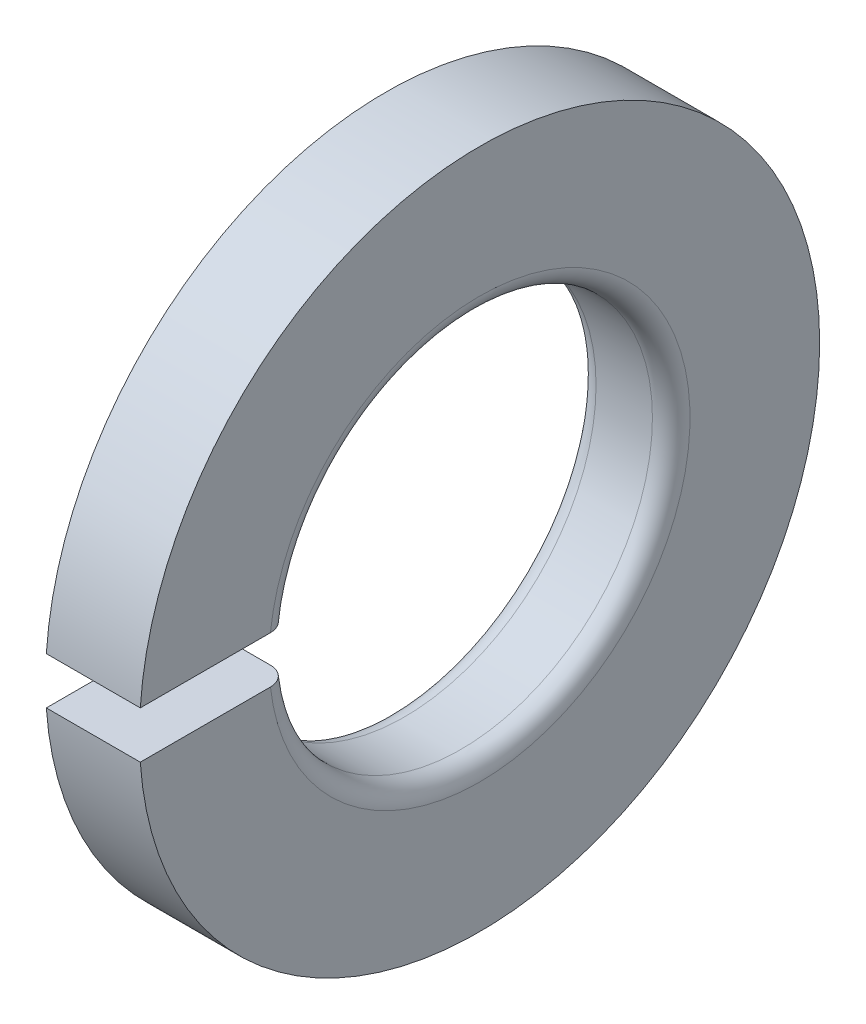
ISO-10303-21;
HEADER;
FILE_DESCRIPTION(('STEP AP214'),'2;1');
FILE_NAME('part.step','',(''),(''),'','','');
FILE_SCHEMA(('AUTOMOTIVE_DESIGN { 1 0 10303 214 1 1 1 1 }'));
ENDSEC;
DATA;
#1=APPLICATION_CONTEXT('core data for automotive mechanical design processes');
#2=APPLICATION_PROTOCOL_DEFINITION('international standard','automotive_design',2000,#1);
#3=PRODUCT_CONTEXT('',#1,'mechanical');
#4=PRODUCT('Part','Part','',(#3));
#5=PRODUCT_RELATED_PRODUCT_CATEGORY('part','',(#4));
#6=PRODUCT_DEFINITION_FORMATION('','',#4);
#7=PRODUCT_DEFINITION_CONTEXT('part definition',#1,'design');
#8=PRODUCT_DEFINITION('design','',#6,#7);
#9=PRODUCT_DEFINITION_SHAPE('','',#8);
#10=(LENGTH_UNIT() NAMED_UNIT(*) SI_UNIT(.MILLI.,.METRE.));
#11=(NAMED_UNIT(*) PLANE_ANGLE_UNIT() SI_UNIT($,.RADIAN.));
#12=(NAMED_UNIT(*) SI_UNIT($,.STERADIAN.) SOLID_ANGLE_UNIT());
#13=UNCERTAINTY_MEASURE_WITH_UNIT(LENGTH_MEASURE(1.E-05),#10,'distance_accuracy_value','');
#14=(GEOMETRIC_REPRESENTATION_CONTEXT(3) GLOBAL_UNCERTAINTY_ASSIGNED_CONTEXT((#13)) GLOBAL_UNIT_ASSIGNED_CONTEXT((#10,
#11,#12)) REPRESENTATION_CONTEXT('',''));
#15=CARTESIAN_POINT('',(0.,0.,0.));
#16=DIRECTION('',(0.,0.,1.));
#17=DIRECTION('',(1.,0.,0.));
#18=AXIS2_PLACEMENT_3D('',#15,#16,#17);
#19=CARTESIAN_POINT('',(-34.925,0.,0.));
#20=DIRECTION('',(-1.,0.,0.));
#21=DIRECTION('',(0.,0.,1.));
#22=AXIS2_PLACEMENT_3D('',#19,#20,#21);
#23=CYLINDRICAL_SURFACE('',#22,9.05);
#24=DIRECTION('',(-1.,0.,0.));
#25=VECTOR('',#24,1.);
#26=CARTESIAN_POINT('',(-34.925,0.624999999999987,9.02839271409928));
#27=LINE('',#26,#25);
#28=CARTESIAN_POINT('',(0.,0.624999999999987,9.02839271409928));
#29=VERTEX_POINT('',#28);
#30=CARTESIAN_POINT('',(-2.5,0.624999999999987,9.02839271409928));
#31=VERTEX_POINT('',#30);
#32=EDGE_CURVE('E251',#29,#31,#27,.T.);
#33=ORIENTED_EDGE('',*,*,#32,.F.);
#34=CARTESIAN_POINT('',(0.,0.,0.));
#35=DIRECTION('',(-1.,0.,0.));
#36=DIRECTION('',(0.,0.,1.));
#37=AXIS2_PLACEMENT_3D('',#34,#35,#36);
#38=CIRCLE('',#37,9.05);
#39=CARTESIAN_POINT('',(0.,-0.624999999999987,9.02839271409928));
#40=VERTEX_POINT('',#39);
#41=EDGE_CURVE('E11',#29,#40,#38,.T.);
#42=ORIENTED_EDGE('',*,*,#41,.T.);
#43=DIRECTION('',(1.,0.,0.));
#44=VECTOR('',#43,1.);
#45=CARTESIAN_POINT('',(-34.925,-0.624999999999987,9.02839271409928));
#46=LINE('',#45,#44);
#47=CARTESIAN_POINT('',(-2.5,-0.624999999999987,9.02839271409928));
#48=VERTEX_POINT('',#47);
#49=EDGE_CURVE('E152',#48,#40,#46,.T.);
#50=ORIENTED_EDGE('',*,*,#49,.F.);
#51=CARTESIAN_POINT('',(-2.5,0.,0.));
#52=DIRECTION('',(-1.,0.,0.));
#53=DIRECTION('',(0.,0.,1.));
#54=AXIS2_PLACEMENT_3D('',#51,#52,#53);
#55=CIRCLE('',#54,9.05);
#56=EDGE_CURVE('E223',#31,#48,#55,.T.);
#57=ORIENTED_EDGE('',*,*,#56,.F.);
#58=EDGE_LOOP('',(#33,#42,#50,#57));
#59=FACE_BOUND('',#58,.T.);
#60=ADVANCED_FACE('F17',(#59),#23,.T.);
#61=CARTESIAN_POINT('',(0.,5.6,0.));
#62=DIRECTION('',(-1.,0.,0.));
#63=DIRECTION('',(0.,0.,1.));
#64=AXIS2_PLACEMENT_3D('',#61,#62,#63);
#65=PLANE('',#64);
#66=DIRECTION('',(0.,0.,-1.));
#67=VECTOR('',#66,1.);
#68=CARTESIAN_POINT('',(0.,0.624999999999987,9.231));
#69=LINE('',#68,#67);
#70=CARTESIAN_POINT('',(0.,0.624999999999987,5.56501347707261));
#71=VERTEX_POINT('',#70);
#72=EDGE_CURVE('E144',#29,#71,#69,.T.);
#73=ORIENTED_EDGE('',*,*,#72,.T.);
#74=CARTESIAN_POINT('',(0.,0.,0.));
#75=DIRECTION('',(-1.,0.,0.));
#76=DIRECTION('',(0.,0.,1.));
#77=AXIS2_PLACEMENT_3D('',#74,#75,#76);
#78=CIRCLE('',#77,5.6);
#79=CARTESIAN_POINT('',(0.,-0.624999999999987,5.56501347707261));
#80=VERTEX_POINT('',#79);
#81=EDGE_CURVE('E30',#71,#80,#78,.T.);
#82=ORIENTED_EDGE('',*,*,#81,.T.);
#83=DIRECTION('',(0.,0.,1.));
#84=VECTOR('',#83,1.);
#85=CARTESIAN_POINT('',(0.,-0.624999999999987,0.));
#86=LINE('',#85,#84);
#87=EDGE_CURVE('E164',#80,#40,#86,.T.);
#88=ORIENTED_EDGE('',*,*,#87,.T.);
#89=ORIENTED_EDGE('',*,*,#41,.F.);
#90=EDGE_LOOP('',(#73,#82,#88,#89));
#91=FACE_BOUND('',#90,.T.);
#92=ADVANCED_FACE('F19',(#91),#65,.F.);
#93=CARTESIAN_POINT('',(-0.5,0.,0.));
#94=DIRECTION('',(-1.,0.,0.));
#95=DIRECTION('',(0.,0.,1.));
#96=AXIS2_PLACEMENT_3D('',#93,#94,#95);
#97=TOROIDAL_SURFACE('',#96,5.6,0.5);
#98=ORIENTED_EDGE('',*,*,#81,.F.);
#99=CARTESIAN_POINT('',(0.,0.624999999999987,5.56501347707261));
#100=CARTESIAN_POINT('',(6.59780501506631E-08,0.625000000845204,5.55851040345573));
#101=CARTESIAN_POINT('',(-0.000125287864080179,0.624996955745399,5.55200734299681));
#102=CARTESIAN_POINT('',(-0.000620427819549987,0.624985934572421,5.53916576996588));
#103=CARTESIAN_POINT('',(-0.000984317260953367,0.62497807774707,5.53282702949047));
#104=CARTESIAN_POINT('',(-0.001938510558033,0.624958733961064,5.5203222625209));
#105=CARTESIAN_POINT('',(-0.00252307053008751,0.624947340298171,5.51415579716452));
#106=CARTESIAN_POINT('',(-0.00390067827574387,0.624922080522118,5.50200245628998));
#107=CARTESIAN_POINT('',(-0.00468814408183376,0.624908283397852,5.49601494746372));
#108=CARTESIAN_POINT('',(-0.00645392462280786,0.624879235039241,5.48422518281379));
#109=CARTESIAN_POINT('',(-0.00742682432502172,0.624864030195836,5.47842211544602));
#110=CARTESIAN_POINT('',(-0.00954615200121427,0.624833051636332,5.46700576060904));
#111=CARTESIAN_POINT('',(-0.0106873366204526,0.62481730343893,5.46139149925642));
#112=CARTESIAN_POINT('',(-0.0131262988976051,0.624785996474455,5.45035621561468));
#113=CARTESIAN_POINT('',(-0.0144190083166586,0.624770444098366,5.44493407285757));
#114=CARTESIAN_POINT('',(-0.0171445043310246,0.62474016662692,5.43428552106857));
#115=CARTESIAN_POINT('',(-0.0185724006804081,0.624725430552137,5.42905785961363));
#116=CARTESIAN_POINT('',(-0.0215522582860248,0.624697310245538,5.41879977798227));
#117=CARTESIAN_POINT('',(-0.0230995080894126,0.624683899416331,5.41376799036812));
#118=CARTESIAN_POINT('',(-0.0263024451270901,0.624658846516341,5.40390260180359));
#119=CARTESIAN_POINT('',(-0.0279536040925807,0.62464716402195,5.39906752482713));
#120=CARTESIAN_POINT('',(-0.0329690258568944,0.62461574439813,5.38507792322897));
#121=CARTESIAN_POINT('',(-0.0365263121360745,0.62459833726402,5.37599169022062));
#122=CARTESIAN_POINT('',(-0.0439178576529249,0.624573658978008,5.35861058067613));
#123=CARTESIAN_POINT('',(-0.0477202103338952,0.624565814654118,5.3503020784901));
#124=CARTESIAN_POINT('',(-0.0554967328799935,0.624560526658418,5.33445879686766));
#125=CARTESIAN_POINT('',(-0.0594418047136641,0.624562414288829,5.32690973650451));
#126=CARTESIAN_POINT('',(-0.0674078213374483,0.624575803028408,5.31256170915133));
#127=CARTESIAN_POINT('',(-0.0714024179406484,0.624586595544608,5.30574809938418));
#128=CARTESIAN_POINT('',(-0.0793811263442449,0.624616153798644,5.29284192938314));
#129=CARTESIAN_POINT('',(-0.0833415336179333,0.624634228514926,5.28673470419488));
#130=CARTESIAN_POINT('',(-0.0911747697193877,0.624676075978489,5.27520885507045));
#131=CARTESIAN_POINT('',(-0.09502642308413,0.62469923371813,5.26977582812587));
#132=CARTESIAN_POINT('',(-0.102573989369437,0.624748448204399,5.25956396668853));
#133=CARTESIAN_POINT('',(-0.106251129898657,0.624774035781096,5.25477124654252));
#134=CARTESIAN_POINT('',(-0.113389974101851,0.624825164037116,5.24580496250638));
#135=CARTESIAN_POINT('',(-0.116835178906566,0.624850441194317,5.24161825367033));
#136=CARTESIAN_POINT('',(-0.123458430138198,0.624897290942914,5.23382954571968));
#137=CARTESIAN_POINT('',(-0.126622118906708,0.624918957194616,5.23021532859649));
#138=CARTESIAN_POINT('',(-0.13263798815907,0.624956523541369,5.22353855665422));
#139=CARTESIAN_POINT('',(-0.135477829915462,0.62497280687798,5.22046488836805));
#140=CARTESIAN_POINT('',(-0.140808687029574,0.62499243369258,5.21483899777136));
#141=CARTESIAN_POINT('',(-0.143289239057397,0.624997333709423,5.21227683690016));
#142=CARTESIAN_POINT('',(-0.152047430137369,0.625006645299554,5.20342226533236));
#143=CARTESIAN_POINT('',(-0.158467233711204,0.62499941524355,5.19726918289311));
#144=CARTESIAN_POINT('',(-0.171556557007585,0.624987913391408,5.18537469512023));
#145=CARTESIAN_POINT('',(-0.178222829485211,0.624983611935698,5.17962970670287));
#146=CARTESIAN_POINT('',(-0.191778378900271,0.624971776744908,5.16855660811742));
#147=CARTESIAN_POINT('',(-0.198664628514998,0.624964276971784,5.16322479445432));
#148=CARTESIAN_POINT('',(-0.212632592576255,0.624949411602847,5.15298159099224));
#149=CARTESIAN_POINT('',(-0.219711513947492,0.624942045423773,5.14806639140252));
#150=CARTESIAN_POINT('',(-0.234038126394589,0.624927950039189,5.13865823685126));
#151=CARTESIAN_POINT('',(-0.241283255893629,0.624921214943851,5.13416138114226));
#152=CARTESIAN_POINT('',(-0.255916108646316,0.624909306136375,5.12559013527452));
#153=CARTESIAN_POINT('',(-0.263301502470205,0.624904116611786,5.12151176797196));
#154=CARTESIAN_POINT('',(-0.278189417773547,0.624895788311472,5.11377619729204));
#155=CARTESIAN_POINT('',(-0.285689840637396,0.624892628188322,5.11011495464055));
#156=CARTESIAN_POINT('',(-0.300783101479257,0.624888650247615,5.10321090163311));
#157=CARTESIAN_POINT('',(-0.308374069835075,0.624887807531356,5.09996400367337));
#158=CARTESIAN_POINT('',(-0.32362453452983,0.624888508058156,5.09388456881241));
#159=CARTESIAN_POINT('',(-0.331282387597626,0.624890025450748,5.09104790932106));
#160=CARTESIAN_POINT('',(-0.346643614080912,0.624895268600954,5.08578363245915));
#161=CARTESIAN_POINT('',(-0.354345567264022,0.624898969957325,5.08335187036523));
#162=CARTESIAN_POINT('',(-0.369772914641155,0.624908189613447,5.0788909139666));
#163=CARTESIAN_POINT('',(-0.377497107680679,0.62491368736733,5.07685756514465));
#164=CARTESIAN_POINT('',(-0.392947824139409,0.624925907254037,5.07318589578102));
#165=CARTESIAN_POINT('',(-0.400673360929644,0.624932615048808,5.07154342275553));
#166=CARTESIAN_POINT('',(-0.416106656870461,0.624946475085499,5.06864499623157));
#167=CARTESIAN_POINT('',(-0.42381363881275,0.624953621480556,5.06738490351081));
#168=CARTESIAN_POINT('',(-0.439190744480218,0.624967398337354,5.06524183013914));
#169=CARTESIAN_POINT('',(-0.446860294830996,0.624974033731456,5.06435473441626));
#170=CARTESIAN_POINT('',(-0.462144510212579,0.624985682482991,5.06294750626103));
#171=CARTESIAN_POINT('',(-0.469758799591386,0.624990713525667,5.06242329244566));
#172=CARTESIAN_POINT('',(-0.48491551078117,0.624997835062903,5.06173076866027));
#173=CARTESIAN_POINT('',(-0.492457748395457,0.62499995880892,5.06155842288894));
#174=CARTESIAN_POINT('',(-0.500000000000001,0.624999999999985,5.06155855443756));
#175=B_SPLINE_CURVE_WITH_KNOTS('',3,(#99,#100,#101,#102,#103,#104,#105,#106,#107,#108,#109,#110,
#111,#112,#113,#114,#115,#116,#117,#118,#119,#120,#121,#122,#123,#124,#125,#126,#127,#128,#129,
#130,#131,#132,#133,#134,#135,#136,#137,#138,#139,#140,#141,#142,#143,#144,#145,#146,#147,#148,
#149,#150,#151,#152,#153,#154,#155,#156,#157,#158,#159,#160,#161,#162,#163,#164,#165,#166,#167,
#168,#169,#170,#171,#172,#173,#174),.UNSPECIFIED.,.F.,.F.,(4,2,2,2,2,2,2,2,2,2,2,2,2,2,2,2,2,2,
2,2,2,2,2,2,2,2,2,2,2,2,2,2,2,2,2,2,2,4),(0.,0.0195079783160063,0.0385510295955347,
0.0571292177717187,0.0752426056286643,0.0928912545795553,0.110075224478616,0.126794573464747,
0.143049357834632,0.158839631943188,0.174165448129251,0.203420844840743,0.230819531412524,
0.256361782271762,0.280047844112425,0.301877937879394,0.321852261670791,0.339970994652557,
0.356234302309494,0.370642343797479,0.383195283094512,0.393893307845129,0.420556410403616,
0.44694529554863,0.473060681647196,0.498903279539482,0.524473794337526,0.549772927406307,
0.574801378511541,0.59955984811968,0.624049039836798,0.648269662974223,0.672222435229901,
0.695908085475639,0.719327356641463,0.742481008689363,0.765369821669714,0.78799459885461),.UNSPECIFIED.);
#176=CARTESIAN_POINT('',(-0.5,0.624999999999987,5.06155855443757));
#177=VERTEX_POINT('',#176);
#178=EDGE_CURVE('E109',#71,#177,#175,.T.);
#179=ORIENTED_EDGE('',*,*,#178,.T.);
#180=CARTESIAN_POINT('',(-0.5,0.,0.));
#181=DIRECTION('',(-1.,0.,0.));
#182=DIRECTION('',(0.,0.,1.));
#183=AXIS2_PLACEMENT_3D('',#180,#181,#182);
#184=CIRCLE('',#183,5.1);
#185=CARTESIAN_POINT('',(-0.5,-0.624999999999987,5.06155855443757));
#186=VERTEX_POINT('',#185);
#187=EDGE_CURVE('E101',#177,#186,#184,.T.);
#188=ORIENTED_EDGE('',*,*,#187,.T.);
#189=CARTESIAN_POINT('',(-0.500000000000001,-0.624999999999989,5.06155855443756));
#190=CARTESIAN_POINT('',(-0.492457191536266,-0.624999958554311,5.06155842285835));
#191=CARTESIAN_POINT('',(-0.484914397105156,-0.624997809473156,5.06173079720451));
#192=CARTESIAN_POINT('',(-0.469755961467032,-0.624990597894243,5.06242346195753));
#193=CARTESIAN_POINT('',(-0.462140505783656,-0.62498550145791,5.06294781689648));
#194=CARTESIAN_POINT('',(-0.446853358934062,-0.624973692947545,5.06435549543978));
#195=CARTESIAN_POINT('',(-0.439182046164309,-0.624966962743637,5.06524292972258));
#196=CARTESIAN_POINT('',(-0.423800836938118,-0.624952977294068,5.0673869333134));
#197=CARTESIAN_POINT('',(-0.416091518099495,-0.6249457168823,5.06864764746104));
#198=CARTESIAN_POINT('',(-0.400652998394545,-0.624931619804802,5.07154765489482));
#199=CARTESIAN_POINT('',(-0.392924580560545,-0.624924788942712,5.07319111756362));
#200=CARTESIAN_POINT('',(-0.377467589667372,-0.624912323594487,5.07686518844619));
#201=CARTESIAN_POINT('',(-0.36974001071944,-0.624906703569339,5.07889997960361));
#202=CARTESIAN_POINT('',(-0.354305425917712,-0.624897249351424,5.08336432550196));
#203=CARTESIAN_POINT('',(-0.346599630432713,-0.624893435969404,5.08579806541951));
#204=CARTESIAN_POINT('',(-0.331230309757538,-0.624887987546708,5.09106688291163));
#205=CARTESIAN_POINT('',(-0.323568215814988,-0.624886377289024,5.09390613595984));
#206=CARTESIAN_POINT('',(-0.308308925181056,-0.624885517961103,5.09999141972296));
#207=CARTESIAN_POINT('',(-0.300713384640359,-0.624886295214148,5.10324160375243));
#208=CARTESIAN_POINT('',(-0.28561071003129,-0.62489017655981,5.11015296319298));
#209=CARTESIAN_POINT('',(-0.278105460385771,-0.624893306089301,5.11381825678145));
#210=CARTESIAN_POINT('',(-0.263207706253143,-0.624901613918993,5.12156273084565));
#211=CARTESIAN_POINT('',(-0.255817317153189,-0.624906814141448,5.12564598088527));
#212=CARTESIAN_POINT('',(-0.241174381845176,-0.624918790809538,5.13422785463937));
#213=CARTESIAN_POINT('',(-0.233924183849885,-0.624925583659497,5.13873048536279));
#214=CARTESIAN_POINT('',(-0.219587444728851,-0.624939844023081,5.14815110591014));
#215=CARTESIAN_POINT('',(-0.212503486009694,-0.624947317979889,5.15307302577373));
#216=CARTESIAN_POINT('',(-0.198525567870418,-0.624962456071597,5.16333063083537));
#217=CARTESIAN_POINT('',(-0.191634424412976,-0.624970121383169,5.168670154388));
#218=CARTESIAN_POINT('',(-0.178069328489256,-0.624982328101126,5.17975966956031));
#219=CARTESIAN_POINT('',(-0.171398428344967,-0.624986835751931,5.1855133923483));
#220=CARTESIAN_POINT('',(-0.1583002105224,-0.624998860193376,5.19742637021581));
#221=CARTESIAN_POINT('',(-0.151876167038019,-0.625006407939398,5.20358923499404));
#222=CARTESIAN_POINT('',(-0.143122254825082,-0.624997438754946,5.2124482207635));
#223=CARTESIAN_POINT('',(-0.140649626593346,-0.624992647962884,5.21500457242046));
#224=CARTESIAN_POINT('',(-0.135334125446031,-0.624973225151546,5.22061915918454));
#225=CARTESIAN_POINT('',(-0.132501705625172,-0.624957025565068,5.22368731453754));
#226=CARTESIAN_POINT('',(-0.126500144944105,-0.624919618093228,5.23035333201988));
#227=CARTESIAN_POINT('',(-0.123343335028073,-0.624898023763593,5.23396229202162));
#228=CARTESIAN_POINT('',(-0.116733269880018,-0.624851298944708,5.241740727057));
#229=CARTESIAN_POINT('',(-0.113294367363827,-0.624826071884596,5.24592240767448));
#230=CARTESIAN_POINT('',(-0.106167525562274,-0.624775024529496,5.25487885865877));
#231=CARTESIAN_POINT('',(-0.102496083024068,-0.624749466335286,5.25966676458653));
#232=CARTESIAN_POINT('',(-0.0949592870122548,-0.624700289996601,5.26986921558969));
#233=CARTESIAN_POINT('',(-0.0911127067671575,-0.624677140204247,5.27529763992021));
#234=CARTESIAN_POINT('',(-0.0832889753111828,-0.624635289206896,5.28681450843343));
#235=CARTESIAN_POINT('',(-0.0793330034996413,-0.624617202742459,5.2929173520542));
#236=CARTESIAN_POINT('',(-0.0713625173529003,-0.624587603774591,5.30581500157371));
#237=CARTESIAN_POINT('',(-0.0673717147645487,-0.624576782396494,5.31262447147252));
#238=CARTESIAN_POINT('',(-0.0594126405468664,-0.624563322149475,5.3269644900487));
#239=CARTESIAN_POINT('',(-0.0554707278184174,-0.62456139225955,5.3345096828816));
#240=CARTESIAN_POINT('',(-0.0476998923188422,-0.62456658623312,5.35034553794667));
#241=CARTESIAN_POINT('',(-0.0439000820171907,-0.624574379374018,5.35865048445522));
#242=CARTESIAN_POINT('',(-0.0365130179518011,-0.624598950666195,5.37602483465189));
#243=CARTESIAN_POINT('',(-0.0329576891405966,-0.624616302683686,5.38510786889196));
#244=CARTESIAN_POINT('',(-0.027944845465393,-0.624647640659406,5.39909275899843));
#245=CARTESIAN_POINT('',(-0.0262944586360789,-0.624659295928503,5.40392638872523));
#246=CARTESIAN_POINT('',(-0.0230929351995156,-0.62468429523275,5.41378899016649));
#247=CARTESIAN_POINT('',(-0.0215463299563252,-0.624697679780662,5.41881943868033));
#248=CARTESIAN_POINT('',(-0.0185676386857404,-0.624725748995312,5.42907495607845));
#249=CARTESIAN_POINT('',(-0.0171402674841175,-0.624740460344238,5.4343013931866));
#250=CARTESIAN_POINT('',(-0.0144157080470193,-0.624770690412438,5.44494761647425));
#251=CARTESIAN_POINT('',(-0.0131234137126929,-0.624786220188702,5.45036865585641));
#252=CARTESIAN_POINT('',(-0.0106851779841802,-0.624817484529665,5.46140185899575));
#253=CARTESIAN_POINT('',(-0.00954430877052018,-0.624833212770859,5.46701514396992));
#254=CARTESIAN_POINT('',(-0.00742551946853745,-0.624864154456175,5.4784296779725));
#255=CARTESIAN_POINT('',(-0.00645284696591561,-0.624879342436033,5.48423190157815));
#256=CARTESIAN_POINT('',(-0.00468744064516736,-0.62490836048716,5.49602011580837));
#257=CARTESIAN_POINT('',(-0.00390012638157403,-0.62492214420584,5.50200691858955));
#258=CARTESIAN_POINT('',(-0.00252275486893576,-0.62494738087554,5.51415898902024));
#259=CARTESIAN_POINT('',(-0.001938284400069,-0.624958764856831,5.52032489048164));
#260=CARTESIAN_POINT('',(-0.000984217620331299,-0.624978093157279,5.53282867506313));
#261=CARTESIAN_POINT('',(-0.000620370295352662,-0.624985944175475,5.53916699741182));
#262=CARTESIAN_POINT('',(-0.000125277473106898,-0.62499695765822,5.55200788240724));
#263=CARTESIAN_POINT('',(6.59659004187509E-08,-0.625000000846242,5.5585106731564));
#264=CARTESIAN_POINT('',(0.,-0.624999999999994,5.56501347707261));
#265=B_SPLINE_CURVE_WITH_KNOTS('',3,(#189,#190,#191,#192,#193,#194,#195,#196,#197,#198,#199,
#200,#201,#202,#203,#204,#205,#206,#207,#208,#209,#210,#211,#212,#213,#214,#215,#216,#217,#218,
#219,#220,#221,#222,#223,#224,#225,#226,#227,#228,#229,#230,#231,#232,#233,#234,#235,#236,#237,
#238,#239,#240,#241,#242,#243,#244,#245,#246,#247,#248,#249,#250,#251,#252,#253,#254,#255,#256,
#257,#258,#259,#260,#261,#262,#263,#264),.UNSPECIFIED.,.F.,.F.,(4,2,2,2,2,2,2,2,2,2,2,2,2,2,2,2,
2,2,2,2,2,2,2,2,2,2,2,2,2,2,2,2,2,2,2,2,2,4),(0.,0.0226264472708259,0.0455187761431365,
0.0686777914212465,0.0921042744625579,0.115798986334015,0.139762670890282,0.163996057767968,
0.188499865289246,0.213274803267192,0.238321575704117,0.263640883373033,0.289233426271268,
0.315099905934042,0.341241027594649,0.367657502176695,0.394350048102668,0.405019023931932,
0.417544714406765,0.431927307083685,0.44816696573594,0.466263849280953,0.486218122961331,
0.508029965708673,0.531699575399873,0.557227172775001,0.584613004342633,0.613857344367144,
0.629178304853884,0.644964172854977,0.661215000713339,0.677930842790853,0.695111755394114,
0.712757796674948,0.730869026503547,0.749445506312115,0.768487298906793,0.787994468245702),.UNSPECIFIED.);
#266=EDGE_CURVE('E190',#186,#80,#265,.T.);
#267=ORIENTED_EDGE('',*,*,#266,.T.);
#268=EDGE_LOOP('',(#98,#179,#188,#267));
#269=FACE_BOUND('',#268,.T.);
#270=ADVANCED_FACE('F134',(#269),#97,.T.);
#271=CARTESIAN_POINT('',(-34.925,0.,0.));
#272=DIRECTION('',(-1.,0.,0.));
#273=DIRECTION('',(0.,0.,1.));
#274=AXIS2_PLACEMENT_3D('',#271,#272,#273);
#275=CYLINDRICAL_SURFACE('',#274,5.1);
#276=DIRECTION('',(1.,0.,0.));
#277=VECTOR('',#276,1.);
#278=CARTESIAN_POINT('',(-34.925,0.624999999999987,5.06155855443757));
#279=LINE('',#278,#277);
#280=CARTESIAN_POINT('',(-2.00000000000069,0.624999999999987,5.06155855443091));
#281=VERTEX_POINT('',#280);
#282=EDGE_CURVE('E102',#281,#177,#279,.T.);
#283=ORIENTED_EDGE('',*,*,#282,.F.);
#284=CARTESIAN_POINT('',(-2.,0.,0.));
#285=DIRECTION('',(-1.,0.,0.));
#286=DIRECTION('',(0.,0.,1.));
#287=AXIS2_PLACEMENT_3D('',#284,#285,#286);
#288=CIRCLE('',#287,5.1);
#289=CARTESIAN_POINT('',(-2.,-0.624999999999987,5.06155855443757));
#290=VERTEX_POINT('',#289);
#291=EDGE_CURVE('E55',#281,#290,#288,.T.);
#292=ORIENTED_EDGE('',*,*,#291,.T.);
#293=DIRECTION('',(-1.,0.,0.));
#294=VECTOR('',#293,1.);
#295=CARTESIAN_POINT('',(-34.925,-0.624999999999987,5.06155855443757));
#296=LINE('',#295,#294);
#297=EDGE_CURVE('E240',#186,#290,#296,.T.);
#298=ORIENTED_EDGE('',*,*,#297,.F.);
#299=ORIENTED_EDGE('',*,*,#187,.F.);
#300=EDGE_LOOP('',(#283,#292,#298,#299));
#301=FACE_BOUND('',#300,.T.);
#302=ADVANCED_FACE('F104',(#301),#275,.F.);
#303=CARTESIAN_POINT('',(-2.,0.,0.));
#304=DIRECTION('',(-1.,0.,0.));
#305=DIRECTION('',(0.,0.,1.));
#306=AXIS2_PLACEMENT_3D('',#303,#304,#305);
#307=TOROIDAL_SURFACE('',#306,5.6,0.5);
#308=ORIENTED_EDGE('',*,*,#291,.F.);
#309=CARTESIAN_POINT('',(-2.,0.625000000000795,5.06155855443746));
#310=CARTESIAN_POINT('',(-2.00754554396145,0.624999958471801,5.06155842266802));
#311=CARTESIAN_POINT('',(-2.01509107386243,0.624997805425141,5.06173092245766));
#312=CARTESIAN_POINT('',(-2.03025508562184,0.624990580487625,5.06242409470058));
#313=CARTESIAN_POINT('',(-2.03787338156417,0.624985474560622,5.06294883880367));
#314=CARTESIAN_POINT('',(-2.05316629482768,0.624973643965218,5.0643575718853));
#315=CARTESIAN_POINT('',(-2.06084053294568,0.624966901114488,5.06524567877604));
#316=CARTESIAN_POINT('',(-2.07622765722449,0.62495288925106,5.06739132215077));
#317=CARTESIAN_POINT('',(-2.08393996452769,0.624945615056753,5.06865301079353));
#318=CARTESIAN_POINT('',(-2.09938450167396,0.624931491060708,5.07155527903473));
#319=CARTESIAN_POINT('',(-2.10711594679335,0.624924647078469,5.07320003539505));
#320=CARTESIAN_POINT('',(-2.12257900664613,0.624912157608855,5.07687702128833));
#321=CARTESIAN_POINT('',(-2.13030962510848,0.624906526623129,5.07891344117492));
#322=CARTESIAN_POINT('',(-2.14575027495433,0.624897053758556,5.08338138631996));
#323=CARTESIAN_POINT('',(-2.15345909332533,0.624893232749375,5.08581710416501));
#324=CARTESIAN_POINT('',(-2.16883441521901,0.624887773148729,5.09109023155797));
#325=CARTESIAN_POINT('',(-2.17649948435279,0.624886159410674,5.09393182395669));
#326=CARTESIAN_POINT('',(-2.19176464812808,0.624885297613642,5.10002215057139));
#327=CARTESIAN_POINT('',(-2.19936308296832,0.624886075952953,5.10327504541158));
#328=CARTESIAN_POINT('',(-2.21447143423119,0.624889963961946,5.11019219832089));
#329=CARTESIAN_POINT('',(-2.22197946206145,0.624893099141141,5.11386058177296));
#330=CARTESIAN_POINT('',(-2.23688262402191,0.624901422303423,5.12161161244006));
#331=CARTESIAN_POINT('',(-2.24427563806922,0.62490663227173,5.12569833628209));
#332=CARTESIAN_POINT('',(-2.2589236364063,0.62491863156242,5.13428753663069));
#333=CARTESIAN_POINT('',(-2.26617626725681,0.624925437336092,5.13879402702695));
#334=CARTESIAN_POINT('',(-2.28051764531378,0.624939725148742,5.14822274481029));
#335=CARTESIAN_POINT('',(-2.28760380435389,0.624947213651643,5.15314890889343));
#336=CARTESIAN_POINT('',(-2.30158585523048,0.624962380864118,5.16341537588771));
#337=CARTESIAN_POINT('',(-2.3084789248144,0.624970060749321,5.16875952354399));
#338=CARTESIAN_POINT('',(-2.32204756239419,0.624982292663688,5.17985865184887));
#339=CARTESIAN_POINT('',(-2.32872007124444,0.624986810863767,5.18561736974066));
#340=CARTESIAN_POINT('',(-2.34182115412925,0.62499885510601,5.19754069216466));
#341=CARTESIAN_POINT('',(-2.34824644665004,0.625006412115143,5.20370891213043));
#342=CARTESIAN_POINT('',(-2.35699820810613,0.624997440747531,5.21257192990659));
#343=CARTESIAN_POINT('',(-2.35946771049246,0.624992656173279,5.21512679016626));
#344=CARTESIAN_POINT('',(-2.36477685700913,0.624973257037722,5.2207383804148));
#345=CARTESIAN_POINT('',(-2.36760605462459,0.624957075507197,5.22380501787136));
#346=CARTESIAN_POINT('',(-2.37360109203717,0.6249197097318,5.23046795218292));
#347=CARTESIAN_POINT('',(-2.37675460779112,0.624898139452602,5.23407533376299));
#348=CARTESIAN_POINT('',(-2.38335803251608,0.624851465557918,5.24185053083073));
#349=CARTESIAN_POINT('',(-2.38679359612466,0.624826265495815,5.24603053847245));
#350=CARTESIAN_POINT('',(-2.393913737905,0.624775271696451,5.25498352963825));
#351=CARTESIAN_POINT('',(-2.39758182727182,0.624749739976137,5.25976963512537));
#352=CARTESIAN_POINT('',(-2.40511192830402,0.624700613338934,5.2699683402827));
#353=CARTESIAN_POINT('',(-2.40895517540385,0.62467748651932,5.27539480557152));
#354=CARTESIAN_POINT('',(-2.41677228960492,0.624635675775617,5.28690758248138));
#355=CARTESIAN_POINT('',(-2.42072498681488,0.624617606221184,5.29300828001404));
#356=CARTESIAN_POINT('',(-2.42868901490741,0.624588033477503,5.30590143881806));
#357=CARTESIAN_POINT('',(-2.43267664450894,0.624577220974228,5.31270855084312));
#358=CARTESIAN_POINT('',(-2.44062951060872,0.624563769645856,5.32704363467065));
#359=CARTESIAN_POINT('',(-2.44456839972356,0.624561839338858,5.33458623784874));
#360=CARTESIAN_POINT('',(-2.45233337729589,0.624567023230335,5.35041668023696));
#361=CARTESIAN_POINT('',(-2.45613036593333,0.624574806268282,5.35871879163525));
#362=CARTESIAN_POINT('',(-2.46351203139192,0.62459934864479,5.37608722996572));
#363=CARTESIAN_POINT('',(-2.46706479706438,0.624616681476947,5.38516717623193));
#364=CARTESIAN_POINT('',(-2.47207405809554,0.624647985778876,5.39914726653815));
#365=CARTESIAN_POINT('',(-2.47372328061674,0.624659628765391,5.40397926089688));
#366=CARTESIAN_POINT('',(-2.47692256117999,0.624684602045246,5.41383853138583));
#367=CARTESIAN_POINT('',(-2.47846808980505,0.624697972826877,5.4188672831447));
#368=CARTESIAN_POINT('',(-2.48144472172516,0.624726013459951,5.42911934884697));
#369=CARTESIAN_POINT('',(-2.48287111221667,0.624740709978801,5.43434402994228));
#370=CARTESIAN_POINT('',(-2.48559381222494,0.62477090983603,5.4449866854918));
#371=CARTESIAN_POINT('',(-2.4868852299317,0.624786424227514,5.450405912178));
#372=CARTESIAN_POINT('',(-2.48932182263263,0.624817657835549,5.46143543753046));
#373=CARTESIAN_POINT('',(-2.49046192760451,0.624833370736731,5.46704685655495));
#374=CARTESIAN_POINT('',(-2.49257930690735,0.624864282458724,5.47845761036905));
#375=CARTESIAN_POINT('',(-2.49355133587384,0.624879455836517,5.48425791899766));
#376=CARTESIAN_POINT('',(-2.49531558184639,0.624908446175084,5.49604225994719));
#377=CARTESIAN_POINT('',(-2.49610238157764,0.624922216818661,5.5020271038162));
#378=CARTESIAN_POINT('',(-2.49747885889387,0.624947429701068,5.51417521894653));
#379=CARTESIAN_POINT('',(-2.49806295203114,0.624958803020688,5.52033912354997));
#380=CARTESIAN_POINT('',(-2.49901640703498,0.624978113329696,5.53283888371402));
#381=CARTESIAN_POINT('',(-2.49938002229498,0.624985957084684,5.53917517818119));
#382=CARTESIAN_POINT('',(-2.49987480153977,0.624996960439349,5.55201198444675));
#383=CARTESIAN_POINT('',(-2.50000006588256,0.625000000845942,5.5585127241822));
#384=CARTESIAN_POINT('',(-2.5,0.624999999999987,5.56501347707261));
#385=B_SPLINE_CURVE_WITH_KNOTS('',3,(#309,#310,#311,#312,#313,#314,#315,#316,#317,#318,#319,
#320,#321,#322,#323,#324,#325,#326,#327,#328,#329,#330,#331,#332,#333,#334,#335,#336,#337,#338,
#339,#340,#341,#342,#343,#344,#345,#346,#347,#348,#349,#350,#351,#352,#353,#354,#355,#356,#357,
#358,#359,#360,#361,#362,#363,#364,#365,#366,#367,#368,#369,#370,#371,#372,#373,#374,#375,#376,
#377,#378,#379,#380,#381,#382,#383,#384),.UNSPECIFIED.,.F.,.F.,(4,2,2,2,2,2,2,2,2,2,2,2,2,2,2,2,
2,2,2,2,2,2,2,2,2,2,2,2,2,2,2,2,2,2,2,2,2,4),(0.,0.0226346515954832,0.0455355521799239,
0.0687035075463105,0.0921392999878826,0.115843691462353,0.139817426677554,0.164061236092811,
0.188575838829393,0.213361945482339,0.238420260824918,0.263751486395834,0.289356322958163,
0.315235472817794,0.341389641987984,0.367819542185429,0.394525892642064,0.40518513563425,
0.417700926840581,0.432073453465688,0.448302879008168,0.466389362157714,0.48633306795532,
0.508134175142671,0.531792881408235,0.557309407297853,0.584683999114938,0.613916930904427,
0.62923212203046,0.645012178322917,0.661257152087332,0.677967097647203,0.69514207126986,
0.71278213106709,0.730887336868437,0.74945775006504,0.7684934334218,0.787994450855677),.UNSPECIFIED.);
#386=CARTESIAN_POINT('',(-2.5,0.624999999999987,5.56501347707261));
#387=VERTEX_POINT('',#386);
#388=EDGE_CURVE('E91',#281,#387,#385,.T.);
#389=ORIENTED_EDGE('',*,*,#388,.T.);
#390=CARTESIAN_POINT('',(-2.5,0.,0.));
#391=DIRECTION('',(-1.,0.,0.));
#392=DIRECTION('',(0.,0.,1.));
#393=AXIS2_PLACEMENT_3D('',#390,#391,#392);
#394=CIRCLE('',#393,5.6);
#395=CARTESIAN_POINT('',(-2.5,-0.624999999999987,5.56501347707261));
#396=VERTEX_POINT('',#395);
#397=EDGE_CURVE('E41',#387,#396,#394,.T.);
#398=ORIENTED_EDGE('',*,*,#397,.T.);
#399=CARTESIAN_POINT('',(-2.5,-0.624999999999994,5.56501347707261));
#400=CARTESIAN_POINT('',(-2.5000000660328,-0.625000000845405,5.55850905733027));
#401=CARTESIAN_POINT('',(-2.49987466026264,-0.624996953923075,5.55200465075386));
#402=CARTESIAN_POINT('',(-2.49937931445793,-0.624985926115762,5.53916040132677));
#403=CARTESIAN_POINT('',(-2.49901527270066,-0.624978064533543,5.5328203304634));
#404=CARTESIAN_POINT('',(-2.49806067791625,-0.624958708967578,5.52031292383762));
#405=CARTESIAN_POINT('',(-2.49747587035281,-0.624947308325363,5.51414514900024));
#406=CARTESIAN_POINT('',(-2.49609767594857,-0.624922032981976,5.50198921491851));
#407=CARTESIAN_POINT('',(-2.49530987262356,-0.624908227302853,5.49600042205583));
#408=CARTESIAN_POINT('',(-2.49354333103526,-0.624879160817634,5.48420811910149));
#409=CARTESIAN_POINT('',(-2.49257000931725,-0.62486394642563,5.478403797064));
#410=CARTESIAN_POINT('',(-2.49044975713308,-0.624832948278832,5.46698496607213));
#411=CARTESIAN_POINT('',(-2.48930807149482,-0.62481719005654,5.46136948274713));
#412=CARTESIAN_POINT('',(-2.48686803224995,-0.624785863015048,5.4503317911846));
#413=CARTESIAN_POINT('',(-2.48557474831297,-0.624770300591981,5.44490846191255));
#414=CARTESIAN_POINT('',(-2.48284803386801,-0.624740003399737,5.43425757542651));
#415=CARTESIAN_POINT('',(-2.48141949499163,-0.624725257648348,5.42902876514932));
#416=CARTESIAN_POINT('',(-2.47843828838535,-0.624697118701734,5.41876842594599));
#417=CARTESIAN_POINT('',(-2.4768903334477,-0.624683698899149,5.41373552887542));
#418=CARTESIAN_POINT('',(-2.47368592767175,-0.624658629046164,5.40386796291458));
#419=CARTESIAN_POINT('',(-2.47203400639129,-0.624646938555804,5.39903181722669));
#420=CARTESIAN_POINT('',(-2.46701623961419,-0.624615497029305,5.38503908070671));
#421=CARTESIAN_POINT('',(-2.46345727601777,-0.624598077439424,5.37595083153189));
#422=CARTESIAN_POINT('',(-2.45606219886438,-0.624573380444659,5.35856586460201));
#423=CARTESIAN_POINT('',(-2.4522580009892,-0.624565529620758,5.35025551381277));
#424=CARTESIAN_POINT('',(-2.44447764910007,-0.624560235252872,5.33440870549967));
#425=CARTESIAN_POINT('',(-2.44053060147002,-0.624562122721456,5.32685795909842));
#426=CARTESIAN_POINT('',(-2.43256052965625,-0.624575517508567,5.31250672153629));
#427=CARTESIAN_POINT('',(-2.42856386125467,-0.624586315929893,5.30569157919995));
#428=CARTESIAN_POINT('',(-2.42058093775455,-0.624615891514795,5.29278249300651));
#429=CARTESIAN_POINT('',(-2.41661839407417,-0.624633977367493,5.28667387549818));
#430=CARTESIAN_POINT('',(-2.40878084257767,-0.624675851276312,5.2751453745513));
#431=CARTESIAN_POINT('',(-2.40492701647453,-0.624699024081433,5.2697110792323));
#432=CARTESIAN_POINT('',(-2.39737508794896,-0.624748271106614,5.25949679522521));
#433=CARTESIAN_POINT('',(-2.39369576360086,-0.624773875991165,5.254702911949));
#434=CARTESIAN_POINT('',(-2.38655255792452,-0.624825039205276,5.24573439536593));
#435=CARTESIAN_POINT('',(-2.38310518066363,-0.624850333961054,5.2415466082136));
#436=CARTESIAN_POINT('',(-2.37647761099426,-0.624897216825266,5.23375581566797));
#437=CARTESIAN_POINT('',(-2.37331178104442,-0.624918898683718,5.23014058348704));
#438=CARTESIAN_POINT('',(-2.36729167395091,-0.624956492005569,5.22346183102082));
#439=CARTESIAN_POINT('',(-2.36444974002649,-0.624972786988072,5.22038718868535));
#440=CARTESIAN_POINT('',(-2.35911475917989,-0.624992428831999,5.21475937712347));
#441=CARTESIAN_POINT('',(-2.35663217985861,-0.62499733266106,5.21219626100479));
#442=CARTESIAN_POINT('',(-2.34787259372571,-0.625006641774349,5.2033443226187));
#443=CARTESIAN_POINT('',(-2.34145359986894,-0.624999416667403,5.19719471946244));
#444=CARTESIAN_POINT('',(-2.32836613474056,-0.624987925954192,5.18530695396666));
#445=CARTESIAN_POINT('',(-2.32170090602597,-0.624983630690893,5.17956521220943));
#446=CARTESIAN_POINT('',(-2.30814765533023,-0.624971810700957,5.16849836323221));
#447=CARTESIAN_POINT('',(-2.30126265630115,-0.624964319887396,5.16316955640124));
#448=CARTESIAN_POINT('',(-2.28729737640389,-0.624949472623577,5.15293211677096));
#449=CARTESIAN_POINT('',(-2.28021988458148,-0.624942115587009,5.14801967826763));
#450=CARTESIAN_POINT('',(-2.2658962870128,-0.624928037587997,5.13861679269189));
#451=CARTESIAN_POINT('',(-2.25865273915276,-0.624921310747048,5.13412244912953));
#452=CARTESIAN_POINT('',(-2.24402317901151,-0.624909416504718,5.12555597317054));
#453=CARTESIAN_POINT('',(-2.23663949281051,-0.624904233319188,5.12147986803194));
#454=CARTESIAN_POINT('',(-2.22175509664466,-0.624895915121977,5.11374856823591));
#455=CARTESIAN_POINT('',(-2.21425648228545,-0.624892758801693,5.11008933882372));
#456=CARTESIAN_POINT('',(-2.19916691800403,-0.624888785557061,5.10318906172543));
#457=CARTESIAN_POINT('',(-2.19157783503081,-0.624887943779299,5.09994393104692));
#458=CARTESIAN_POINT('',(-2.17633119752353,-0.624888643243271,5.093867784829));
#459=CARTESIAN_POINT('',(-2.1686752839196,-0.624890158681636,5.09103265137832));
#460=CARTESIAN_POINT('',(-2.15331797095322,-0.624895395231931,5.08577118693534));
#461=CARTESIAN_POINT('',(-2.14561798980832,-0.624899091987084,5.08334071594266));
#462=CARTESIAN_POINT('',(-2.13019460062934,-0.624908300257249,5.07888210978278));
#463=CARTESIAN_POINT('',(-2.12247239205369,-0.62491379126382,5.0768498248432));
#464=CARTESIAN_POINT('',(-2.10702563959571,-0.62492599621878,5.07318006025904));
#465=CARTESIAN_POINT('',(-2.09930208095641,-0.624932695855189,5.07153843287636));
#466=CARTESIAN_POINT('',(-2.08387271879956,-0.624946539098994,5.06864148474611));
#467=CARTESIAN_POINT('',(-2.0761676914047,-0.624953676870066,5.0673820295031));
#468=CARTESIAN_POINT('',(-2.06079445620328,-0.624967437163986,5.06524002926658));
#469=CARTESIAN_POINT('',(-2.05312682097515,-0.624974064610017,5.0643533738903));
#470=CARTESIAN_POINT('',(-2.03784638259861,-0.624985699461004,5.06294683643974));
#471=CARTESIAN_POINT('',(-2.03023395458416,-0.624990724518738,5.06242287761775));
#472=CARTESIAN_POINT('',(-2.01508089974081,-0.624997837624199,5.06173068652449));
#473=CARTESIAN_POINT('',(-2.00754045685649,-0.624999958862427,5.06155842301365));
#474=CARTESIAN_POINT('',(-2.,-0.624999999999989,5.06155855443756));
#475=B_SPLINE_CURVE_WITH_KNOTS('',3,(#399,#400,#401,#402,#403,#404,#405,#406,#407,#408,#409,
#410,#411,#412,#413,#414,#415,#416,#417,#418,#419,#420,#421,#422,#423,#424,#425,#426,#427,#428,
#429,#430,#431,#432,#433,#434,#435,#436,#437,#438,#439,#440,#441,#442,#443,#444,#445,#446,#447,
#448,#449,#450,#451,#452,#453,#454,#455,#456,#457,#458,#459,#460,#461,#462,#463,#464,#465,#466,
#467,#468,#469,#470,#471,#472,#473,#474),.UNSPECIFIED.,.F.,.F.,(4,2,2,2,2,2,2,2,2,2,2,2,2,2,2,2,
2,2,2,2,2,2,2,2,2,2,2,2,2,2,2,2,2,2,2,2,2,4),(0.,0.0195120159223841,0.0385590751704773,
0.0571412417045656,0.0752585783359601,0.0929111465049173,0.11009900609245,0.126822215263835,
0.143080830341624,0.158874905705996,0.174204493720398,0.203467343554401,0.230873366135267,
0.256422836034035,0.280116000079097,0.301953079342494,0.321934272045653,0.34005975747875,
0.356329701258473,0.370744262689734,0.383303605930448,0.394007918856091,0.420662060710738,
0.447042227322132,0.473149136526527,0.498983498644108,0.524546018275617,0.549837396280972,
0.574858331924243,0.599609525170513,0.624091679121345,0.648305502576718,0.672251712712443,
0.695931037863243,0.719344220402716,0.742492019712481,0.765375215233812,0.78799460959598),.UNSPECIFIED.);
#476=EDGE_CURVE('E100',#396,#290,#475,.T.);
#477=ORIENTED_EDGE('',*,*,#476,.T.);
#478=EDGE_LOOP('',(#308,#389,#398,#477));
#479=FACE_BOUND('',#478,.T.);
#480=ADVANCED_FACE('F93',(#479),#307,.T.);
#481=CARTESIAN_POINT('',(-2.5,9.05,0.));
#482=DIRECTION('',(1.,0.,0.));
#483=DIRECTION('',(0.,1.,0.));
#484=AXIS2_PLACEMENT_3D('',#481,#482,#483);
#485=PLANE('',#484);
#486=DIRECTION('',(0.,0.,-1.));
#487=VECTOR('',#486,1.);
#488=CARTESIAN_POINT('',(-2.5,0.624999999999987,0.));
#489=LINE('',#488,#487);
#490=EDGE_CURVE('E116',#31,#387,#489,.T.);
#491=ORIENTED_EDGE('',*,*,#490,.F.);
#492=ORIENTED_EDGE('',*,*,#56,.T.);
#493=DIRECTION('',(0.,0.,1.));
#494=VECTOR('',#493,1.);
#495=CARTESIAN_POINT('',(-2.5,-0.624999999999987,0.));
#496=LINE('',#495,#494);
#497=EDGE_CURVE('E229',#396,#48,#496,.T.);
#498=ORIENTED_EDGE('',*,*,#497,.F.);
#499=ORIENTED_EDGE('',*,*,#397,.F.);
#500=EDGE_LOOP('',(#491,#492,#498,#499));
#501=FACE_BOUND('',#500,.T.);
#502=ADVANCED_FACE('F207',(#501),#485,.F.);
#503=CARTESIAN_POINT('',(-2.5,-0.624999999999987,0.));
#504=DIRECTION('',(0.,1.,0.));
#505=DIRECTION('',(1.,0.,0.));
#506=AXIS2_PLACEMENT_3D('',#503,#504,#505);
#507=PLANE('',#506);
#508=ORIENTED_EDGE('',*,*,#49,.T.);
#509=ORIENTED_EDGE('',*,*,#87,.F.);
#510=ORIENTED_EDGE('',*,*,#266,.F.);
#511=ORIENTED_EDGE('',*,*,#297,.T.);
#512=ORIENTED_EDGE('',*,*,#476,.F.);
#513=ORIENTED_EDGE('',*,*,#497,.T.);
#514=EDGE_LOOP('',(#508,#509,#510,#511,#512,#513));
#515=FACE_BOUND('',#514,.T.);
#516=ADVANCED_FACE('F133',(#515),#507,.T.);
#517=CARTESIAN_POINT('',(-2.5,0.624999999999987,9.231));
#518=DIRECTION('',(0.,-1.,0.));
#519=DIRECTION('',(0.,0.,-1.));
#520=AXIS2_PLACEMENT_3D('',#517,#518,#519);
#521=PLANE('',#520);
#522=ORIENTED_EDGE('',*,*,#32,.T.);
#523=ORIENTED_EDGE('',*,*,#490,.T.);
#524=ORIENTED_EDGE('',*,*,#388,.F.);
#525=ORIENTED_EDGE('',*,*,#282,.T.);
#526=ORIENTED_EDGE('',*,*,#178,.F.);
#527=ORIENTED_EDGE('',*,*,#72,.F.);
#528=EDGE_LOOP('',(#522,#523,#524,#525,#526,#527));
#529=FACE_BOUND('',#528,.T.);
#530=ADVANCED_FACE('F111',(#529),#521,.T.);
#531=CLOSED_SHELL('',(#60,#92,#270,#302,#480,#502,#516,#530));
#532=MANIFOLD_SOLID_BREP('B1',#531);
#533=ADVANCED_BREP_SHAPE_REPRESENTATION('',(#18,#532),#14);
#534=SHAPE_DEFINITION_REPRESENTATION(#9,#533);
ENDSEC;
END-ISO-10303-21;
